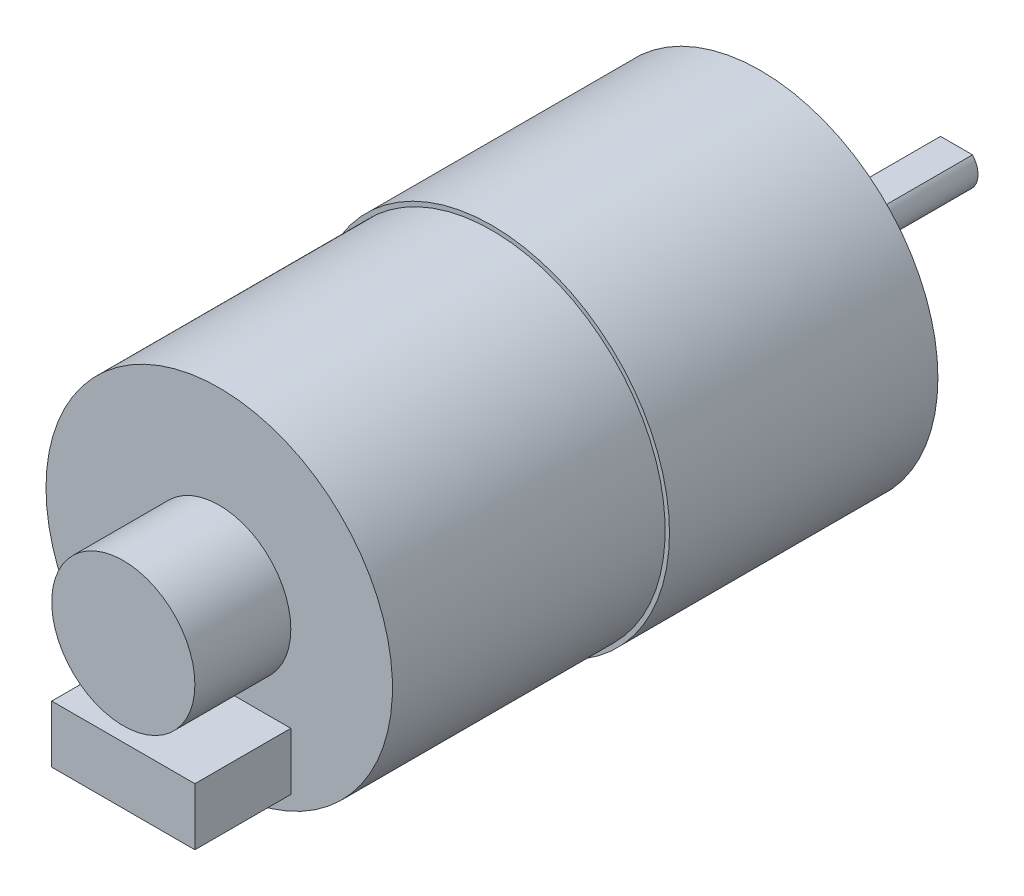
ISO-10303-21;
HEADER;
FILE_DESCRIPTION(('STEP AP214'),'2;1');
FILE_NAME('part.step','',(''),(''),'','','');
FILE_SCHEMA(('AUTOMOTIVE_DESIGN { 1 0 10303 214 1 1 1 1 }'));
ENDSEC;
DATA;
#1=APPLICATION_CONTEXT('core data for automotive mechanical design processes');
#2=APPLICATION_PROTOCOL_DEFINITION('international standard','automotive_design',2000,#1);
#3=PRODUCT_CONTEXT('',#1,'mechanical');
#4=PRODUCT('Part','Part','',(#3));
#5=PRODUCT_RELATED_PRODUCT_CATEGORY('part','',(#4));
#6=PRODUCT_DEFINITION_FORMATION('','',#4);
#7=PRODUCT_DEFINITION_CONTEXT('part definition',#1,'design');
#8=PRODUCT_DEFINITION('design','',#6,#7);
#9=PRODUCT_DEFINITION_SHAPE('','',#8);
#10=(LENGTH_UNIT() NAMED_UNIT(*) SI_UNIT(.MILLI.,.METRE.));
#11=(NAMED_UNIT(*) PLANE_ANGLE_UNIT() SI_UNIT($,.RADIAN.));
#12=(NAMED_UNIT(*) SI_UNIT($,.STERADIAN.) SOLID_ANGLE_UNIT());
#13=UNCERTAINTY_MEASURE_WITH_UNIT(LENGTH_MEASURE(1.E-05),#10,'distance_accuracy_value','');
#14=(GEOMETRIC_REPRESENTATION_CONTEXT(3) GLOBAL_UNCERTAINTY_ASSIGNED_CONTEXT((#13)) GLOBAL_UNIT_ASSIGNED_CONTEXT((#10,
#11,#12)) REPRESENTATION_CONTEXT('',''));
#15=CARTESIAN_POINT('',(0.,0.,0.));
#16=DIRECTION('',(0.,0.,1.));
#17=DIRECTION('',(1.,0.,0.));
#18=AXIS2_PLACEMENT_3D('',#15,#16,#17);
#19=CARTESIAN_POINT('',(5.,-6.,27.8));
#20=DIRECTION('',(1.,0.,0.));
#21=DIRECTION('',(0.,0.,-1.));
#22=AXIS2_PLACEMENT_3D('',#19,#20,#21);
#23=PLANE('',#22);
#24=DIRECTION('',(0.,1.,0.));
#25=VECTOR('',#24,1.);
#26=CARTESIAN_POINT('',(5.,-6.,44.5));
#27=LINE('',#26,#25);
#28=CARTESIAN_POINT('',(5.,-10.,44.5));
#29=VERTEX_POINT('',#28);
#30=CARTESIAN_POINT('',(5.,-6.,44.5));
#31=VERTEX_POINT('',#30);
#32=EDGE_CURVE('E116',#29,#31,#27,.T.);
#33=ORIENTED_EDGE('',*,*,#32,.F.);
#34=DIRECTION('',(0.,0.,1.));
#35=VECTOR('',#34,1.);
#36=CARTESIAN_POINT('',(5.,-10.,27.8));
#37=LINE('',#36,#35);
#38=CARTESIAN_POINT('',(5.,-10.,27.8));
#39=VERTEX_POINT('',#38);
#40=EDGE_CURVE('E12',#39,#29,#37,.T.);
#41=ORIENTED_EDGE('',*,*,#40,.F.);
#42=DIRECTION('',(0.,1.,0.));
#43=VECTOR('',#42,1.);
#44=CARTESIAN_POINT('',(5.,-6.,27.8));
#45=LINE('',#44,#43);
#46=CARTESIAN_POINT('',(5.,-6.,27.8));
#47=VERTEX_POINT('',#46);
#48=EDGE_CURVE('E110',#39,#47,#45,.T.);
#49=ORIENTED_EDGE('',*,*,#48,.T.);
#50=DIRECTION('',(0.,0.,1.));
#51=VECTOR('',#50,1.);
#52=CARTESIAN_POINT('',(5.,-6.,27.8));
#53=LINE('',#52,#51);
#54=EDGE_CURVE('E55',#47,#31,#53,.T.);
#55=ORIENTED_EDGE('',*,*,#54,.T.);
#56=EDGE_LOOP('',(#33,#41,#49,#55));
#57=FACE_BOUND('',#56,.T.);
#58=ADVANCED_FACE('F52',(#57),#23,.T.);
#59=CARTESIAN_POINT('',(-5.,-10.,27.8));
#60=DIRECTION('',(0.,-1.,0.));
#61=DIRECTION('',(0.,0.,-1.));
#62=AXIS2_PLACEMENT_3D('',#59,#60,#61);
#63=PLANE('',#62);
#64=DIRECTION('',(1.,0.,0.));
#65=VECTOR('',#64,1.);
#66=CARTESIAN_POINT('',(-5.,-10.,44.5));
#67=LINE('',#66,#65);
#68=CARTESIAN_POINT('',(-5.,-10.,44.5));
#69=VERTEX_POINT('',#68);
#70=EDGE_CURVE('E112',#69,#29,#67,.T.);
#71=ORIENTED_EDGE('',*,*,#70,.F.);
#72=DIRECTION('',(0.,0.,1.));
#73=VECTOR('',#72,1.);
#74=CARTESIAN_POINT('',(-5.,-10.,27.8));
#75=LINE('',#74,#73);
#76=CARTESIAN_POINT('',(-5.,-10.,27.8));
#77=VERTEX_POINT('',#76);
#78=EDGE_CURVE('E61',#77,#69,#75,.T.);
#79=ORIENTED_EDGE('',*,*,#78,.F.);
#80=DIRECTION('',(1.,0.,0.));
#81=VECTOR('',#80,1.);
#82=CARTESIAN_POINT('',(-5.,-10.,27.8));
#83=LINE('',#82,#81);
#84=EDGE_CURVE('E107',#77,#39,#83,.T.);
#85=ORIENTED_EDGE('',*,*,#84,.T.);
#86=ORIENTED_EDGE('',*,*,#40,.T.);
#87=EDGE_LOOP('',(#71,#79,#85,#86));
#88=FACE_BOUND('',#87,.T.);
#89=ADVANCED_FACE('F126',(#88),#63,.T.);
#90=CARTESIAN_POINT('',(-5.,-6.,27.8));
#91=DIRECTION('',(-1.,0.,0.));
#92=DIRECTION('',(0.,-1.,0.));
#93=AXIS2_PLACEMENT_3D('',#90,#91,#92);
#94=PLANE('',#93);
#95=DIRECTION('',(0.,-1.,0.));
#96=VECTOR('',#95,1.);
#97=CARTESIAN_POINT('',(-5.,-6.,44.5));
#98=LINE('',#97,#96);
#99=CARTESIAN_POINT('',(-5.,-6.,44.5));
#100=VERTEX_POINT('',#99);
#101=EDGE_CURVE('E102',#100,#69,#98,.T.);
#102=ORIENTED_EDGE('',*,*,#101,.F.);
#103=DIRECTION('',(0.,0.,1.));
#104=VECTOR('',#103,1.);
#105=CARTESIAN_POINT('',(-5.,-6.,27.8));
#106=LINE('',#105,#104);
#107=CARTESIAN_POINT('',(-5.,-6.,27.8));
#108=VERTEX_POINT('',#107);
#109=EDGE_CURVE('E97',#108,#100,#106,.T.);
#110=ORIENTED_EDGE('',*,*,#109,.F.);
#111=DIRECTION('',(0.,-1.,0.));
#112=VECTOR('',#111,1.);
#113=CARTESIAN_POINT('',(-5.,-6.,27.8));
#114=LINE('',#113,#112);
#115=EDGE_CURVE('E100',#108,#77,#114,.T.);
#116=ORIENTED_EDGE('',*,*,#115,.T.);
#117=ORIENTED_EDGE('',*,*,#78,.T.);
#118=EDGE_LOOP('',(#102,#110,#116,#117));
#119=FACE_BOUND('',#118,.T.);
#120=ADVANCED_FACE('F99',(#119),#94,.T.);
#121=CARTESIAN_POINT('',(-5.,-6.,27.8));
#122=DIRECTION('',(0.,1.,0.));
#123=DIRECTION('',(0.,0.,1.));
#124=AXIS2_PLACEMENT_3D('',#121,#122,#123);
#125=PLANE('',#124);
#126=DIRECTION('',(-1.,0.,0.));
#127=VECTOR('',#126,1.);
#128=CARTESIAN_POINT('',(-5.,-6.,44.5));
#129=LINE('',#128,#127);
#130=EDGE_CURVE('E119',#31,#100,#129,.T.);
#131=ORIENTED_EDGE('',*,*,#130,.F.);
#132=ORIENTED_EDGE('',*,*,#54,.F.);
#133=DIRECTION('',(-1.,0.,0.));
#134=VECTOR('',#133,1.);
#135=CARTESIAN_POINT('',(-5.,-6.,27.8));
#136=LINE('',#135,#134);
#137=EDGE_CURVE('E106',#47,#108,#136,.T.);
#138=ORIENTED_EDGE('',*,*,#137,.T.);
#139=ORIENTED_EDGE('',*,*,#109,.T.);
#140=EDGE_LOOP('',(#131,#132,#138,#139));
#141=FACE_BOUND('',#140,.T.);
#142=ADVANCED_FACE('F109',(#141),#125,.T.);
#143=CARTESIAN_POINT('',(0.,0.,27.8));
#144=DIRECTION('',(0.,0.,1.));
#145=DIRECTION('',(1.,0.,0.));
#146=AXIS2_PLACEMENT_3D('',#143,#144,#145);
#147=PLANE('',#146);
#148=ORIENTED_EDGE('',*,*,#48,.F.);
#149=ORIENTED_EDGE('',*,*,#84,.F.);
#150=ORIENTED_EDGE('',*,*,#115,.F.);
#151=ORIENTED_EDGE('',*,*,#137,.F.);
#152=EDGE_LOOP('',(#148,#149,#150,#151));
#153=FACE_BOUND('',#152,.T.);
#154=ADVANCED_FACE('F105',(#153),#147,.F.);
#155=CARTESIAN_POINT('',(0.,0.,44.5));
#156=DIRECTION('',(0.,0.,1.));
#157=DIRECTION('',(1.,0.,0.));
#158=AXIS2_PLACEMENT_3D('',#155,#156,#157);
#159=PLANE('',#158);
#160=ORIENTED_EDGE('',*,*,#32,.T.);
#161=ORIENTED_EDGE('',*,*,#130,.T.);
#162=ORIENTED_EDGE('',*,*,#101,.T.);
#163=ORIENTED_EDGE('',*,*,#70,.T.);
#164=EDGE_LOOP('',(#160,#161,#162,#163));
#165=FACE_BOUND('',#164,.T.);
#166=ADVANCED_FACE('F125',(#165),#159,.T.);
#167=CLOSED_SHELL('',(#58,#89,#120,#142,#154,#166));
#168=MANIFOLD_SOLID_BREP('B2',#167);
#169=CARTESIAN_POINT('',(0.,0.,18.75));
#170=DIRECTION('',(0.,0.,-1.));
#171=DIRECTION('',(-1.,0.,0.));
#172=AXIS2_PLACEMENT_3D('',#169,#170,#171);
#173=CYLINDRICAL_SURFACE('',#172,12.4);
#174=CARTESIAN_POINT('',(0.,0.,18.75));
#175=DIRECTION('',(0.,0.,1.));
#176=DIRECTION('',(1.,0.,0.));
#177=AXIS2_PLACEMENT_3D('',#174,#175,#176);
#178=CIRCLE('',#177,12.4);
#179=CARTESIAN_POINT('',(12.4,0.,18.75));
#180=VERTEX_POINT('',#179);
#181=EDGE_CURVE('E271',#180,#180,#178,.T.);
#182=ORIENTED_EDGE('',*,*,#181,.F.);
#183=EDGE_LOOP('',(#182));
#184=FACE_BOUND('',#183,.T.);
#185=CARTESIAN_POINT('',(0.,0.,0.));
#186=DIRECTION('',(0.,0.,1.));
#187=DIRECTION('',(1.,0.,0.));
#188=AXIS2_PLACEMENT_3D('',#185,#186,#187);
#189=CIRCLE('',#188,12.4);
#190=CARTESIAN_POINT('',(12.4,0.,0.));
#191=VERTEX_POINT('',#190);
#192=EDGE_CURVE('E267',#191,#191,#189,.T.);
#193=ORIENTED_EDGE('',*,*,#192,.T.);
#194=EDGE_LOOP('',(#193));
#195=FACE_BOUND('',#194,.T.);
#196=ADVANCED_FACE('F175',(#184,#195),#173,.T.);
#197=CARTESIAN_POINT('',(0.,0.,18.75));
#198=DIRECTION('',(0.,0.,1.));
#199=DIRECTION('',(1.,0.,0.));
#200=AXIS2_PLACEMENT_3D('',#197,#198,#199);
#201=PLANE('',#200);
#202=CARTESIAN_POINT('',(0.,0.,18.75));
#203=DIRECTION('',(0.,0.,1.));
#204=DIRECTION('',(1.,0.,0.));
#205=AXIS2_PLACEMENT_3D('',#202,#203,#204);
#206=CIRCLE('',#205,12.1);
#207=CARTESIAN_POINT('',(-12.1,0.,18.75));
#208=VERTEX_POINT('',#207);
#209=EDGE_CURVE('E263',#208,#208,#206,.T.);
#210=ORIENTED_EDGE('',*,*,#209,.F.);
#211=EDGE_LOOP('',(#210));
#212=FACE_BOUND('',#211,.T.);
#213=ORIENTED_EDGE('',*,*,#181,.T.);
#214=EDGE_LOOP('',(#213));
#215=FACE_BOUND('',#214,.T.);
#216=ADVANCED_FACE('F300',(#212,#215),#201,.T.);
#217=CARTESIAN_POINT('',(0.,0.,0.));
#218=DIRECTION('',(0.,0.,1.));
#219=DIRECTION('',(1.,0.,0.));
#220=AXIS2_PLACEMENT_3D('',#217,#218,#219);
#221=PLANE('',#220);
#222=CARTESIAN_POINT('',(-8.5,0.,0.));
#223=DIRECTION('',(0.,0.,-1.));
#224=DIRECTION('',(-1.,0.,0.));
#225=AXIS2_PLACEMENT_3D('',#222,#223,#224);
#226=CIRCLE('',#225,1.24999999999999);
#227=CARTESIAN_POINT('',(-9.74999999999999,0.,0.));
#228=VERTEX_POINT('',#227);
#229=EDGE_CURVE('E221',#228,#228,#226,.T.);
#230=ORIENTED_EDGE('',*,*,#229,.F.);
#231=EDGE_LOOP('',(#230));
#232=FACE_BOUND('',#231,.T.);
#233=CARTESIAN_POINT('',(8.5,0.,0.));
#234=DIRECTION('',(0.,0.,-1.));
#235=DIRECTION('',(-1.,0.,0.));
#236=AXIS2_PLACEMENT_3D('',#233,#234,#235);
#237=CIRCLE('',#236,1.24999999999999);
#238=CARTESIAN_POINT('',(7.25000000000001,0.,0.));
#239=VERTEX_POINT('',#238);
#240=EDGE_CURVE('E220',#239,#239,#237,.T.);
#241=ORIENTED_EDGE('',*,*,#240,.F.);
#242=EDGE_LOOP('',(#241));
#243=FACE_BOUND('',#242,.T.);
#244=CARTESIAN_POINT('',(0.,0.,0.));
#245=DIRECTION('',(0.,0.,-1.));
#246=DIRECTION('',(-1.,0.,0.));
#247=AXIS2_PLACEMENT_3D('',#244,#245,#246);
#248=CIRCLE('',#247,3.5);
#249=CARTESIAN_POINT('',(3.5,0.,0.));
#250=VERTEX_POINT('',#249);
#251=EDGE_CURVE('E255',#250,#250,#248,.T.);
#252=ORIENTED_EDGE('',*,*,#251,.F.);
#253=EDGE_LOOP('',(#252));
#254=FACE_BOUND('',#253,.T.);
#255=ORIENTED_EDGE('',*,*,#192,.F.);
#256=EDGE_LOOP('',(#255));
#257=FACE_BOUND('',#256,.T.);
#258=ADVANCED_FACE('F305',(#232,#243,#254,#257),#221,.F.);
#259=CARTESIAN_POINT('',(0.,0.,37.8));
#260=DIRECTION('',(0.,0.,-1.));
#261=DIRECTION('',(-1.,0.,0.));
#262=AXIS2_PLACEMENT_3D('',#259,#260,#261);
#263=CYLINDRICAL_SURFACE('',#262,12.1);
#264=CARTESIAN_POINT('',(0.,0.,37.8));
#265=DIRECTION('',(0.,0.,1.));
#266=DIRECTION('',(1.,0.,0.));
#267=AXIS2_PLACEMENT_3D('',#264,#265,#266);
#268=CIRCLE('',#267,12.1);
#269=CARTESIAN_POINT('',(-12.1,0.,37.8));
#270=VERTEX_POINT('',#269);
#271=EDGE_CURVE('E259',#270,#270,#268,.T.);
#272=CARTESIAN_POINT('',(-12.1,0.,37.8));
#273=CARTESIAN_POINT('',(-12.1,0.,37.6015625));
#274=CARTESIAN_POINT('',(-12.1,0.,37.403125));
#275=CARTESIAN_POINT('',(-12.1,0.,37.00625));
#276=CARTESIAN_POINT('',(-12.1,0.,36.8078125));
#277=CARTESIAN_POINT('',(-12.1,0.,36.4109375));
#278=CARTESIAN_POINT('',(-12.1,0.,36.2125));
#279=CARTESIAN_POINT('',(-12.1,0.,35.815625));
#280=CARTESIAN_POINT('',(-12.1,0.,35.6171875));
#281=CARTESIAN_POINT('',(-12.1,0.,35.2203125));
#282=CARTESIAN_POINT('',(-12.1,0.,35.021875));
#283=CARTESIAN_POINT('',(-12.1,0.,34.625));
#284=CARTESIAN_POINT('',(-12.1,0.,34.4265625));
#285=CARTESIAN_POINT('',(-12.1,0.,34.0296875));
#286=CARTESIAN_POINT('',(-12.1,0.,33.83125));
#287=CARTESIAN_POINT('',(-12.1,0.,33.434375));
#288=CARTESIAN_POINT('',(-12.1,0.,33.2359375));
#289=CARTESIAN_POINT('',(-12.1,0.,32.8390625));
#290=CARTESIAN_POINT('',(-12.1,0.,32.640625));
#291=CARTESIAN_POINT('',(-12.1,0.,32.24375));
#292=CARTESIAN_POINT('',(-12.1,0.,32.0453125));
#293=CARTESIAN_POINT('',(-12.1,0.,31.6484375));
#294=CARTESIAN_POINT('',(-12.1,0.,31.45));
#295=CARTESIAN_POINT('',(-12.1,0.,31.053125));
#296=CARTESIAN_POINT('',(-12.1,0.,30.8546875));
#297=CARTESIAN_POINT('',(-12.1,0.,30.4578125));
#298=CARTESIAN_POINT('',(-12.1,0.,30.259375));
#299=CARTESIAN_POINT('',(-12.1,0.,29.8625));
#300=CARTESIAN_POINT('',(-12.1,0.,29.6640625));
#301=CARTESIAN_POINT('',(-12.1,0.,29.2671875));
#302=CARTESIAN_POINT('',(-12.1,0.,29.06875));
#303=CARTESIAN_POINT('',(-12.1,0.,28.671875));
#304=CARTESIAN_POINT('',(-12.1,0.,28.4734375));
#305=CARTESIAN_POINT('',(-12.1,0.,28.0765625));
#306=CARTESIAN_POINT('',(-12.1,0.,27.878125));
#307=CARTESIAN_POINT('',(-12.1,0.,27.48125));
#308=CARTESIAN_POINT('',(-12.1,0.,27.2828125));
#309=CARTESIAN_POINT('',(-12.1,0.,26.8859375));
#310=CARTESIAN_POINT('',(-12.1,0.,26.6875));
#311=CARTESIAN_POINT('',(-12.1,0.,26.290625));
#312=CARTESIAN_POINT('',(-12.1,0.,26.0921875));
#313=CARTESIAN_POINT('',(-12.1,0.,25.6953125));
#314=CARTESIAN_POINT('',(-12.1,0.,25.496875));
#315=CARTESIAN_POINT('',(-12.1,0.,25.1));
#316=CARTESIAN_POINT('',(-12.1,0.,24.9015625));
#317=CARTESIAN_POINT('',(-12.1,0.,24.5046875));
#318=CARTESIAN_POINT('',(-12.1,0.,24.30625));
#319=CARTESIAN_POINT('',(-12.1,0.,23.909375));
#320=CARTESIAN_POINT('',(-12.1,0.,23.7109375));
#321=CARTESIAN_POINT('',(-12.1,0.,23.3140625));
#322=CARTESIAN_POINT('',(-12.1,0.,23.115625));
#323=CARTESIAN_POINT('',(-12.1,0.,22.71875));
#324=CARTESIAN_POINT('',(-12.1,0.,22.5203125));
#325=CARTESIAN_POINT('',(-12.1,0.,22.1234375));
#326=CARTESIAN_POINT('',(-12.1,0.,21.925));
#327=CARTESIAN_POINT('',(-12.1,0.,21.528125));
#328=CARTESIAN_POINT('',(-12.1,0.,21.3296875));
#329=CARTESIAN_POINT('',(-12.1,0.,20.9328125));
#330=CARTESIAN_POINT('',(-12.1,0.,20.734375));
#331=CARTESIAN_POINT('',(-12.1,0.,20.3375));
#332=CARTESIAN_POINT('',(-12.1,0.,20.1390625));
#333=CARTESIAN_POINT('',(-12.1,0.,19.7421875));
#334=CARTESIAN_POINT('',(-12.1,0.,19.54375));
#335=CARTESIAN_POINT('',(-12.1,0.,19.146875));
#336=CARTESIAN_POINT('',(-12.1,0.,18.9484375));
#337=CARTESIAN_POINT('',(-12.1,0.,18.75));
#338=B_SPLINE_CURVE_WITH_KNOTS('',3,(#272,#273,#274,#275,#276,#277,#278,#279,#280,#281,#282,
#283,#284,#285,#286,#287,#288,#289,#290,#291,#292,#293,#294,#295,#296,#297,#298,#299,#300,#301,
#302,#303,#304,#305,#306,#307,#308,#309,#310,#311,#312,#313,#314,#315,#316,#317,#318,#319,#320,
#321,#322,#323,#324,#325,#326,#327,#328,#329,#330,#331,#332,#333,#334,#335,#336,#337),
.UNSPECIFIED.,.F.,.F.,(4,2,2,2,2,2,2,2,2,2,2,2,2,2,2,2,2,2,2,2,2,2,2,2,2,2,2,2,2,2,2,2,4),(0.,
0.595312499999993,1.19062499999999,1.78593749999999,2.38124999999999,2.97656249999999,3.571875,
4.1671875,4.7625,5.3578125,5.953125,6.5484375,7.14375,7.7390625,8.33437499999999,
8.92968749999999,9.525,10.1203125,10.715625,11.3109375,11.90625,12.5015625,13.096875,13.6921875,
14.2875,14.8828125,15.478125,16.0734375,16.66875,17.2640625,17.859375,18.4546875,19.05),.UNSPECIFIED.);
#339=EDGE_CURVE('BSEAM313',#270,#208,#338,.T.);
#340=ORIENTED_EDGE('',*,*,#271,.F.);
#341=ORIENTED_EDGE('',*,*,#209,.T.);
#342=ORIENTED_EDGE('',*,*,#339,.T.);
#343=ORIENTED_EDGE('',*,*,#339,.F.);
#344=EDGE_LOOP('',(#340,#342,#341,#343));
#345=FACE_BOUND('',#344,.T.);
#346=ADVANCED_FACE('F313',(#345),#263,.T.);
#347=CARTESIAN_POINT('',(0.,0.,37.8));
#348=DIRECTION('',(0.,0.,1.));
#349=DIRECTION('',(1.,0.,0.));
#350=AXIS2_PLACEMENT_3D('',#347,#348,#349);
#351=PLANE('',#350);
#352=CARTESIAN_POINT('',(0.,0.,37.8));
#353=DIRECTION('',(0.,0.,1.));
#354=DIRECTION('',(1.,0.,0.));
#355=AXIS2_PLACEMENT_3D('',#352,#353,#354);
#356=CIRCLE('',#355,5.);
#357=CARTESIAN_POINT('',(5.,0.,37.8));
#358=VERTEX_POINT('',#357);
#359=EDGE_CURVE('E50',#358,#358,#356,.T.);
#360=ORIENTED_EDGE('',*,*,#359,.F.);
#361=EDGE_LOOP('',(#360));
#362=FACE_BOUND('',#361,.T.);
#363=ORIENTED_EDGE('',*,*,#271,.T.);
#364=EDGE_LOOP('',(#363));
#365=FACE_BOUND('',#364,.T.);
#366=ADVANCED_FACE('F318',(#362,#365),#351,.T.);
#367=CARTESIAN_POINT('',(0.,0.,-2.7));
#368=DIRECTION('',(0.,0.,1.));
#369=DIRECTION('',(1.,0.,0.));
#370=AXIS2_PLACEMENT_3D('',#367,#368,#369);
#371=CYLINDRICAL_SURFACE('',#370,3.5);
#372=CARTESIAN_POINT('',(0.,0.,-2.7));
#373=DIRECTION('',(0.,0.,-1.));
#374=DIRECTION('',(-1.,0.,0.));
#375=AXIS2_PLACEMENT_3D('',#372,#373,#374);
#376=CIRCLE('',#375,3.5);
#377=CARTESIAN_POINT('',(3.5,0.,-2.7));
#378=VERTEX_POINT('',#377);
#379=EDGE_CURVE('E249',#378,#378,#376,.T.);
#380=CARTESIAN_POINT('',(3.5,0.,-2.7));
#381=CARTESIAN_POINT('',(3.5,0.,-2.671875));
#382=CARTESIAN_POINT('',(3.5,0.,-2.64375));
#383=CARTESIAN_POINT('',(3.5,0.,-2.5875));
#384=CARTESIAN_POINT('',(3.5,0.,-2.559375));
#385=CARTESIAN_POINT('',(3.5,0.,-2.503125));
#386=CARTESIAN_POINT('',(3.5,0.,-2.475));
#387=CARTESIAN_POINT('',(3.5,0.,-2.41875));
#388=CARTESIAN_POINT('',(3.5,0.,-2.390625));
#389=CARTESIAN_POINT('',(3.5,0.,-2.334375));
#390=CARTESIAN_POINT('',(3.5,0.,-2.30625));
#391=CARTESIAN_POINT('',(3.5,0.,-2.25));
#392=CARTESIAN_POINT('',(3.5,0.,-2.221875));
#393=CARTESIAN_POINT('',(3.5,0.,-2.165625));
#394=CARTESIAN_POINT('',(3.5,0.,-2.1375));
#395=CARTESIAN_POINT('',(3.5,0.,-2.08125));
#396=CARTESIAN_POINT('',(3.5,0.,-2.053125));
#397=CARTESIAN_POINT('',(3.5,0.,-1.996875));
#398=CARTESIAN_POINT('',(3.5,0.,-1.96875));
#399=CARTESIAN_POINT('',(3.5,0.,-1.9125));
#400=CARTESIAN_POINT('',(3.5,0.,-1.884375));
#401=CARTESIAN_POINT('',(3.5,0.,-1.828125));
#402=CARTESIAN_POINT('',(3.5,0.,-1.8));
#403=CARTESIAN_POINT('',(3.5,0.,-1.74375));
#404=CARTESIAN_POINT('',(3.5,0.,-1.715625));
#405=CARTESIAN_POINT('',(3.5,0.,-1.659375));
#406=CARTESIAN_POINT('',(3.5,0.,-1.63125));
#407=CARTESIAN_POINT('',(3.5,0.,-1.575));
#408=CARTESIAN_POINT('',(3.5,0.,-1.546875));
#409=CARTESIAN_POINT('',(3.5,0.,-1.490625));
#410=CARTESIAN_POINT('',(3.5,0.,-1.4625));
#411=CARTESIAN_POINT('',(3.5,0.,-1.40625));
#412=CARTESIAN_POINT('',(3.5,0.,-1.378125));
#413=CARTESIAN_POINT('',(3.5,0.,-1.321875));
#414=CARTESIAN_POINT('',(3.5,0.,-1.29375));
#415=CARTESIAN_POINT('',(3.5,0.,-1.2375));
#416=CARTESIAN_POINT('',(3.5,0.,-1.209375));
#417=CARTESIAN_POINT('',(3.5,0.,-1.153125));
#418=CARTESIAN_POINT('',(3.5,0.,-1.125));
#419=CARTESIAN_POINT('',(3.5,0.,-1.06875));
#420=CARTESIAN_POINT('',(3.5,0.,-1.040625));
#421=CARTESIAN_POINT('',(3.5,0.,-0.984375));
#422=CARTESIAN_POINT('',(3.5,0.,-0.956249999999999));
#423=CARTESIAN_POINT('',(3.5,0.,-0.899999999999999));
#424=CARTESIAN_POINT('',(3.5,0.,-0.871875));
#425=CARTESIAN_POINT('',(3.5,0.,-0.815624999999999));
#426=CARTESIAN_POINT('',(3.5,0.,-0.787499999999999));
#427=CARTESIAN_POINT('',(3.5,0.,-0.73125));
#428=CARTESIAN_POINT('',(3.5,0.,-0.703125));
#429=CARTESIAN_POINT('',(3.5,0.,-0.646875));
#430=CARTESIAN_POINT('',(3.5,0.,-0.61875));
#431=CARTESIAN_POINT('',(3.5,0.,-0.5625));
#432=CARTESIAN_POINT('',(3.5,0.,-0.534375));
#433=CARTESIAN_POINT('',(3.5,0.,-0.478125));
#434=CARTESIAN_POINT('',(3.5,0.,-0.45));
#435=CARTESIAN_POINT('',(3.5,0.,-0.39375));
#436=CARTESIAN_POINT('',(3.5,0.,-0.365625));
#437=CARTESIAN_POINT('',(3.5,0.,-0.309375));
#438=CARTESIAN_POINT('',(3.5,0.,-0.28125));
#439=CARTESIAN_POINT('',(3.5,0.,-0.225));
#440=CARTESIAN_POINT('',(3.5,0.,-0.196875));
#441=CARTESIAN_POINT('',(3.5,0.,-0.140625));
#442=CARTESIAN_POINT('',(3.5,0.,-0.1125));
#443=CARTESIAN_POINT('',(3.5,0.,-0.0562499999999997));
#444=CARTESIAN_POINT('',(3.5,0.,-0.0281249999999996));
#445=CARTESIAN_POINT('',(3.5,0.,0.));
#446=B_SPLINE_CURVE_WITH_KNOTS('',3,(#380,#381,#382,#383,#384,#385,#386,#387,#388,#389,#390,
#391,#392,#393,#394,#395,#396,#397,#398,#399,#400,#401,#402,#403,#404,#405,#406,#407,#408,#409,
#410,#411,#412,#413,#414,#415,#416,#417,#418,#419,#420,#421,#422,#423,#424,#425,#426,#427,#428,
#429,#430,#431,#432,#433,#434,#435,#436,#437,#438,#439,#440,#441,#442,#443,#444,#445),
.UNSPECIFIED.,.F.,.F.,(4,2,2,2,2,2,2,2,2,2,2,2,2,2,2,2,2,2,2,2,2,2,2,2,2,2,2,2,2,2,2,2,4),(0.,
0.0843750000000003,0.16875,0.253125,0.3375,0.421875,0.50625,0.590625,0.675,0.759375,0.84375,
0.928125000000001,1.0125,1.096875,1.18125,1.265625,1.35,1.434375,1.51875,1.603125,1.6875,
1.771875,1.85625,1.940625,2.025,2.109375,2.19375,2.278125,2.3625,2.446875,2.53125,2.615625,2.7),.UNSPECIFIED.);
#447=EDGE_CURVE('BSEAM326',#378,#250,#446,.T.);
#448=ORIENTED_EDGE('',*,*,#379,.F.);
#449=ORIENTED_EDGE('',*,*,#251,.T.);
#450=ORIENTED_EDGE('',*,*,#447,.T.);
#451=ORIENTED_EDGE('',*,*,#447,.F.);
#452=EDGE_LOOP('',(#448,#450,#449,#451));
#453=FACE_BOUND('',#452,.T.);
#454=ADVANCED_FACE('F326',(#453),#371,.T.);
#455=CARTESIAN_POINT('',(0.,0.,-2.7));
#456=DIRECTION('',(0.,0.,-1.));
#457=DIRECTION('',(-1.,0.,0.));
#458=AXIS2_PLACEMENT_3D('',#455,#456,#457);
#459=PLANE('',#458);
#460=CARTESIAN_POINT('',(0.,0.,-2.7));
#461=DIRECTION('',(0.,0.,-1.));
#462=DIRECTION('',(-1.,0.,0.));
#463=AXIS2_PLACEMENT_3D('',#460,#461,#462);
#464=CIRCLE('',#463,1.5);
#465=CARTESIAN_POINT('',(-1.5,0.,-2.7));
#466=VERTEX_POINT('',#465);
#467=EDGE_CURVE('E250',#466,#466,#464,.T.);
#468=ORIENTED_EDGE('',*,*,#467,.F.);
#469=EDGE_LOOP('',(#468));
#470=FACE_BOUND('',#469,.T.);
#471=ORIENTED_EDGE('',*,*,#379,.T.);
#472=EDGE_LOOP('',(#471));
#473=FACE_BOUND('',#472,.T.);
#474=ADVANCED_FACE('F296',(#470,#473),#459,.T.);
#475=CARTESIAN_POINT('',(0.,0.,-13.7));
#476=DIRECTION('',(0.,0.,1.));
#477=DIRECTION('',(1.,0.,0.));
#478=AXIS2_PLACEMENT_3D('',#475,#476,#477);
#479=CYLINDRICAL_SURFACE('',#478,1.5);
#480=CARTESIAN_POINT('',(0.,0.,-13.7));
#481=DIRECTION('',(0.,0.,-1.));
#482=DIRECTION('',(-1.,0.,0.));
#483=AXIS2_PLACEMENT_3D('',#480,#481,#482);
#484=CIRCLE('',#483,1.5);
#485=CARTESIAN_POINT('',(1.1180339887499,1.,-13.7));
#486=VERTEX_POINT('',#485);
#487=CARTESIAN_POINT('',(-1.1180339887499,1.,-13.7));
#488=VERTEX_POINT('',#487);
#489=EDGE_CURVE('E245',#486,#488,#484,.T.);
#490=ORIENTED_EDGE('',*,*,#489,.F.);
#491=DIRECTION('',(0.,0.,1.));
#492=VECTOR('',#491,1.);
#493=CARTESIAN_POINT('',(1.1180339887499,1.,-13.7));
#494=LINE('',#493,#492);
#495=CARTESIAN_POINT('',(1.1180339887499,1.,-5.7));
#496=VERTEX_POINT('',#495);
#497=EDGE_CURVE('E191',#486,#496,#494,.T.);
#498=ORIENTED_EDGE('',*,*,#497,.T.);
#499=CARTESIAN_POINT('',(0.,0.,-5.7));
#500=DIRECTION('',(0.,0.,-1.));
#501=DIRECTION('',(-1.,0.,0.));
#502=AXIS2_PLACEMENT_3D('',#499,#500,#501);
#503=CIRCLE('',#502,1.5);
#504=CARTESIAN_POINT('',(-1.1180339887499,1.,-5.7));
#505=VERTEX_POINT('',#504);
#506=EDGE_CURVE('E178',#505,#496,#503,.T.);
#507=ORIENTED_EDGE('',*,*,#506,.F.);
#508=DIRECTION('',(0.,0.,1.));
#509=VECTOR('',#508,1.);
#510=CARTESIAN_POINT('',(-1.1180339887499,1.,-13.7));
#511=LINE('',#510,#509);
#512=EDGE_CURVE('E196',#505,#488,#511,.F.);
#513=ORIENTED_EDGE('',*,*,#512,.T.);
#514=EDGE_LOOP('',(#490,#498,#507,#513));
#515=FACE_BOUND('',#514,.T.);
#516=ORIENTED_EDGE('',*,*,#467,.T.);
#517=EDGE_LOOP('',(#516));
#518=FACE_BOUND('',#517,.T.);
#519=ADVANCED_FACE('F285',(#515,#518),#479,.T.);
#520=CARTESIAN_POINT('',(0.,0.,-13.7));
#521=DIRECTION('',(0.,0.,-1.));
#522=DIRECTION('',(-1.,0.,0.));
#523=AXIS2_PLACEMENT_3D('',#520,#521,#522);
#524=PLANE('',#523);
#525=DIRECTION('',(-1.,0.,0.));
#526=VECTOR('',#525,1.);
#527=CARTESIAN_POINT('',(0.,1.,-13.7));
#528=LINE('',#527,#526);
#529=EDGE_CURVE('E254',#486,#488,#528,.T.);
#530=ORIENTED_EDGE('',*,*,#529,.F.);
#531=ORIENTED_EDGE('',*,*,#489,.T.);
#532=EDGE_LOOP('',(#530,#531));
#533=FACE_BOUND('',#532,.T.);
#534=ADVANCED_FACE('F288',(#533),#524,.T.);
#535=CARTESIAN_POINT('',(0.,0.,-5.7));
#536=DIRECTION('',(0.,0.,-1.));
#537=DIRECTION('',(-1.,0.,0.));
#538=AXIS2_PLACEMENT_3D('',#535,#536,#537);
#539=PLANE('',#538);
#540=ORIENTED_EDGE('',*,*,#506,.T.);
#541=DIRECTION('',(-1.,0.,0.));
#542=VECTOR('',#541,1.);
#543=CARTESIAN_POINT('',(1.57058696384387,1.,-5.7));
#544=LINE('',#543,#542);
#545=EDGE_CURVE('E237',#496,#505,#544,.T.);
#546=ORIENTED_EDGE('',*,*,#545,.T.);
#547=EDGE_LOOP('',(#540,#546));
#548=FACE_BOUND('',#547,.T.);
#549=ADVANCED_FACE('F281',(#548),#539,.T.);
#550=CARTESIAN_POINT('',(1.57058696384387,1.,-5.7));
#551=DIRECTION('',(0.,-1.,0.));
#552=DIRECTION('',(0.,0.,-1.));
#553=AXIS2_PLACEMENT_3D('',#550,#551,#552);
#554=PLANE('',#553);
#555=ORIENTED_EDGE('',*,*,#529,.T.);
#556=ORIENTED_EDGE('',*,*,#512,.F.);
#557=ORIENTED_EDGE('',*,*,#545,.F.);
#558=ORIENTED_EDGE('',*,*,#497,.F.);
#559=EDGE_LOOP('',(#555,#556,#557,#558));
#560=FACE_BOUND('',#559,.T.);
#561=ADVANCED_FACE('F283',(#560),#554,.F.);
#562=CARTESIAN_POINT('',(0.,0.,44.5));
#563=DIRECTION('',(0.,0.,-1.));
#564=DIRECTION('',(-1.,0.,0.));
#565=AXIS2_PLACEMENT_3D('',#562,#563,#564);
#566=CYLINDRICAL_SURFACE('',#565,5.);
#567=CARTESIAN_POINT('',(0.,0.,44.5));
#568=DIRECTION('',(0.,0.,1.));
#569=DIRECTION('',(1.,0.,0.));
#570=AXIS2_PLACEMENT_3D('',#567,#568,#569);
#571=CIRCLE('',#570,5.);
#572=CARTESIAN_POINT('',(5.,0.,44.5));
#573=VERTEX_POINT('',#572);
#574=EDGE_CURVE('E234',#573,#573,#571,.T.);
#575=ORIENTED_EDGE('',*,*,#574,.F.);
#576=EDGE_LOOP('',(#575));
#577=FACE_BOUND('',#576,.T.);
#578=ORIENTED_EDGE('',*,*,#359,.T.);
#579=EDGE_LOOP('',(#578));
#580=FACE_BOUND('',#579,.T.);
#581=ADVANCED_FACE('F366',(#577,#580),#566,.T.);
#582=CARTESIAN_POINT('',(0.,0.,44.5));
#583=DIRECTION('',(0.,0.,1.));
#584=DIRECTION('',(1.,0.,0.));
#585=AXIS2_PLACEMENT_3D('',#582,#583,#584);
#586=PLANE('',#585);
#587=ORIENTED_EDGE('',*,*,#574,.T.);
#588=EDGE_LOOP('',(#587));
#589=FACE_BOUND('',#588,.T.);
#590=ADVANCED_FACE('F382',(#589),#586,.T.);
#591=CARTESIAN_POINT('',(8.5,0.,4.24892422621555));
#592=DIRECTION('',(0.,0.,-1.));
#593=DIRECTION('',(-1.,0.,0.));
#594=AXIS2_PLACEMENT_3D('',#591,#592,#593);
#595=CONICAL_SURFACE('',#594,1.25,1.02974425867665);
#596=CARTESIAN_POINT('',(8.5,0.,5.));
#597=VERTEX_POINT('',#596);
#598=VERTEX_LOOP('',#597);
#599=FACE_BOUND('',#598,.T.);
#600=CARTESIAN_POINT('',(8.5,0.,4.24892422621555));
#601=DIRECTION('',(0.,0.,-1.));
#602=DIRECTION('',(-1.,0.,0.));
#603=AXIS2_PLACEMENT_3D('',#600,#601,#602);
#604=CIRCLE('',#603,1.25);
#605=CARTESIAN_POINT('',(7.25,0.,4.24892422621555));
#606=VERTEX_POINT('',#605);
#607=EDGE_CURVE('E226',#606,#606,#604,.T.);
#608=ORIENTED_EDGE('',*,*,#607,.T.);
#609=EDGE_LOOP('',(#608));
#610=FACE_BOUND('',#609,.T.);
#611=ADVANCED_FACE('F392',(#599,#610),#595,.F.);
#612=CARTESIAN_POINT('',(8.5,0.,0.));
#613=DIRECTION('',(0.,0.,-1.));
#614=DIRECTION('',(-1.,0.,0.));
#615=AXIS2_PLACEMENT_3D('',#612,#613,#614);
#616=CYLINDRICAL_SURFACE('',#615,1.24999999999999);
#617=ORIENTED_EDGE('',*,*,#607,.F.);
#618=EDGE_LOOP('',(#617));
#619=FACE_BOUND('',#618,.T.);
#620=ORIENTED_EDGE('',*,*,#240,.T.);
#621=EDGE_LOOP('',(#620));
#622=FACE_BOUND('',#621,.T.);
#623=ADVANCED_FACE('F213',(#619,#622),#616,.F.);
#624=CARTESIAN_POINT('',(-8.5,0.,4.24892422621555));
#625=DIRECTION('',(0.,0.,-1.));
#626=DIRECTION('',(-1.,0.,0.));
#627=AXIS2_PLACEMENT_3D('',#624,#625,#626);
#628=CONICAL_SURFACE('',#627,1.25,1.02974425867665);
#629=CARTESIAN_POINT('',(-8.5,0.,5.));
#630=VERTEX_POINT('',#629);
#631=VERTEX_LOOP('',#630);
#632=FACE_BOUND('',#631,.T.);
#633=CARTESIAN_POINT('',(-8.5,0.,4.24892422621555));
#634=DIRECTION('',(0.,0.,-1.));
#635=DIRECTION('',(-1.,0.,0.));
#636=AXIS2_PLACEMENT_3D('',#633,#634,#635);
#637=CIRCLE('',#636,1.25);
#638=CARTESIAN_POINT('',(-9.75,0.,4.24892422621555));
#639=VERTEX_POINT('',#638);
#640=EDGE_CURVE('E217',#639,#639,#637,.T.);
#641=ORIENTED_EDGE('',*,*,#640,.T.);
#642=EDGE_LOOP('',(#641));
#643=FACE_BOUND('',#642,.T.);
#644=ADVANCED_FACE('F209',(#632,#643),#628,.F.);
#645=CARTESIAN_POINT('',(-8.5,0.,0.));
#646=DIRECTION('',(0.,0.,-1.));
#647=DIRECTION('',(-1.,0.,0.));
#648=AXIS2_PLACEMENT_3D('',#645,#646,#647);
#649=CYLINDRICAL_SURFACE('',#648,1.24999999999999);
#650=ORIENTED_EDGE('',*,*,#640,.F.);
#651=EDGE_LOOP('',(#650));
#652=FACE_BOUND('',#651,.T.);
#653=ORIENTED_EDGE('',*,*,#229,.T.);
#654=EDGE_LOOP('',(#653));
#655=FACE_BOUND('',#654,.T.);
#656=ADVANCED_FACE('F212',(#652,#655),#649,.F.);
#657=CLOSED_SHELL('',(#196,#216,#258,#346,#366,#454,#474,#519,#534,#549,#561,#581,#590,#611,
#623,#644,#656));
#658=MANIFOLD_SOLID_BREP('B6',#657);
#659=ADVANCED_BREP_SHAPE_REPRESENTATION('',(#18,#168,#658),#14);
#660=SHAPE_DEFINITION_REPRESENTATION(#9,#659);
ENDSEC;
END-ISO-10303-21;
